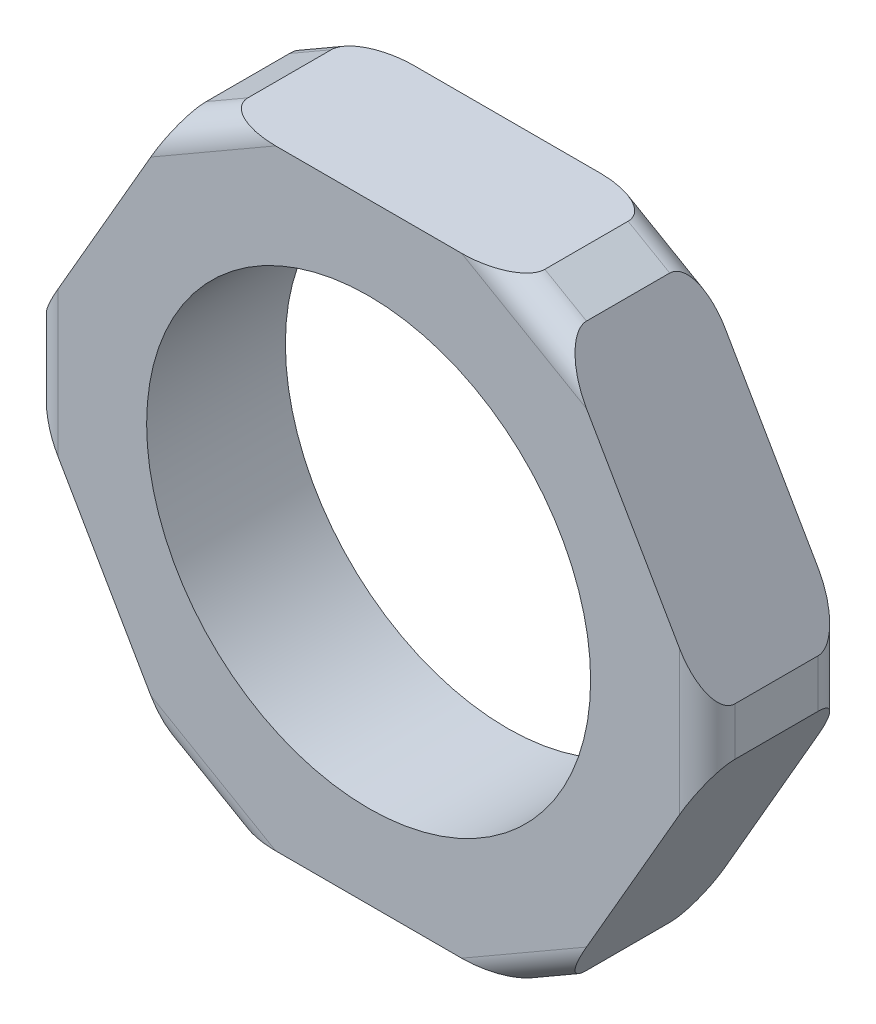
ISO-10303-21;
HEADER;
FILE_DESCRIPTION(('STEP AP214'),'2;1');
FILE_NAME('part.step','',(''),(''),'','','');
FILE_SCHEMA(('AUTOMOTIVE_DESIGN { 1 0 10303 214 1 1 1 1 }'));
ENDSEC;
DATA;
#1=APPLICATION_CONTEXT('core data for automotive mechanical design processes');
#2=APPLICATION_PROTOCOL_DEFINITION('international standard','automotive_design',2000,#1);
#3=PRODUCT_CONTEXT('',#1,'mechanical');
#4=PRODUCT('Part','Part','',(#3));
#5=PRODUCT_RELATED_PRODUCT_CATEGORY('part','',(#4));
#6=PRODUCT_DEFINITION_FORMATION('','',#4);
#7=PRODUCT_DEFINITION_CONTEXT('part definition',#1,'design');
#8=PRODUCT_DEFINITION('design','',#6,#7);
#9=PRODUCT_DEFINITION_SHAPE('','',#8);
#10=(LENGTH_UNIT() NAMED_UNIT(*) SI_UNIT(.MILLI.,.METRE.));
#11=(NAMED_UNIT(*) PLANE_ANGLE_UNIT() SI_UNIT($,.RADIAN.));
#12=(NAMED_UNIT(*) SI_UNIT($,.STERADIAN.) SOLID_ANGLE_UNIT());
#13=UNCERTAINTY_MEASURE_WITH_UNIT(LENGTH_MEASURE(1.E-05),#10,'distance_accuracy_value','');
#14=(GEOMETRIC_REPRESENTATION_CONTEXT(3) GLOBAL_UNCERTAINTY_ASSIGNED_CONTEXT((#13)) GLOBAL_UNIT_ASSIGNED_CONTEXT((#10,
#11,#12)) REPRESENTATION_CONTEXT('',''));
#15=CARTESIAN_POINT('',(0.,0.,0.));
#16=DIRECTION('',(0.,0.,1.));
#17=DIRECTION('',(1.,0.,0.));
#18=AXIS2_PLACEMENT_3D('',#15,#16,#17);
#19=CARTESIAN_POINT('',(0.,0.,2.5));
#20=DIRECTION('',(0.,0.,1.));
#21=DIRECTION('',(1.,0.,0.));
#22=AXIS2_PLACEMENT_3D('',#19,#20,#21);
#23=PLANE('',#22);
#24=DIRECTION('',(-0.5,0.866025403784438,0.));
#25=VECTOR('',#24,1.);
#26=CARTESIAN_POINT('',(12.7017059221718,0.,2.5));
#27=LINE('',#26,#25);
#28=CARTESIAN_POINT('',(11.2017059221718,2.59807621135329,2.5));
#29=VERTEX_POINT('',#28);
#30=CARTESIAN_POINT('',(7.85085296108589,8.40192378864667,2.5));
#31=VERTEX_POINT('',#30);
#32=EDGE_CURVE('E227',#29,#31,#27,.T.);
#33=ORIENTED_EDGE('',*,*,#32,.T.);
#34=DIRECTION('',(0.866025403784437,-0.500000000000002,0.));
#35=VECTOR('',#34,1.);
#36=CARTESIAN_POINT('',(5.60085296108591,9.70096189432332,2.5));
#37=LINE('',#36,#35);
#38=CARTESIAN_POINT('',(3.35085296108589,11.,2.5));
#39=VERTEX_POINT('',#38);
#40=EDGE_CURVE('E208',#31,#39,#37,.F.);
#41=ORIENTED_EDGE('',*,*,#40,.T.);
#42=DIRECTION('',(-1.,0.,0.));
#43=VECTOR('',#42,1.);
#44=CARTESIAN_POINT('',(6.35085296108588,11.,2.5));
#45=LINE('',#44,#43);
#46=CARTESIAN_POINT('',(-3.35085296108587,11.,2.5));
#47=VERTEX_POINT('',#46);
#48=EDGE_CURVE('E223',#39,#47,#45,.T.);
#49=ORIENTED_EDGE('',*,*,#48,.T.);
#50=DIRECTION('',(0.86602540378444,0.499999999999998,0.));
#51=VECTOR('',#50,1.);
#52=CARTESIAN_POINT('',(-5.60085296108586,9.70096189432336,2.5));
#53=LINE('',#52,#51);
#54=CARTESIAN_POINT('',(-7.85085296108588,8.40192378864669,2.5));
#55=VERTEX_POINT('',#54);
#56=EDGE_CURVE('E323',#47,#55,#53,.F.);
#57=ORIENTED_EDGE('',*,*,#56,.T.);
#58=DIRECTION('',(-0.5,-0.866025403784438,0.));
#59=VECTOR('',#58,1.);
#60=CARTESIAN_POINT('',(-6.35085296108589,11.,2.5));
#61=LINE('',#60,#59);
#62=CARTESIAN_POINT('',(-11.2017059221718,2.59807621135332,2.5));
#63=VERTEX_POINT('',#62);
#64=EDGE_CURVE('E236',#55,#63,#61,.T.);
#65=ORIENTED_EDGE('',*,*,#64,.T.);
#66=DIRECTION('',(0.,1.,0.));
#67=VECTOR('',#66,1.);
#68=CARTESIAN_POINT('',(-11.2017059221718,0.,2.5));
#69=LINE('',#68,#67);
#70=CARTESIAN_POINT('',(-11.2017059221718,-2.59807621135329,2.5));
#71=VERTEX_POINT('',#70);
#72=EDGE_CURVE('E326',#63,#71,#69,.F.);
#73=ORIENTED_EDGE('',*,*,#72,.T.);
#74=DIRECTION('',(0.5,-0.866025403784438,0.));
#75=VECTOR('',#74,1.);
#76=CARTESIAN_POINT('',(-12.7017059221718,0.,2.5));
#77=LINE('',#76,#75);
#78=CARTESIAN_POINT('',(-7.85085296108589,-8.40192378864667,2.5));
#79=VERTEX_POINT('',#78);
#80=EDGE_CURVE('E241',#71,#79,#77,.T.);
#81=ORIENTED_EDGE('',*,*,#80,.T.);
#82=DIRECTION('',(-0.866025403784438,0.500000000000002,0.));
#83=VECTOR('',#82,1.);
#84=CARTESIAN_POINT('',(-5.6008529610859,-9.70096189432332,2.5));
#85=LINE('',#84,#83);
#86=CARTESIAN_POINT('',(-3.35085296108589,-11.,2.5));
#87=VERTEX_POINT('',#86);
#88=EDGE_CURVE('E330',#79,#87,#85,.F.);
#89=ORIENTED_EDGE('',*,*,#88,.T.);
#90=DIRECTION('',(1.,0.,0.));
#91=VECTOR('',#90,1.);
#92=CARTESIAN_POINT('',(-6.35085296108588,-11.,2.5));
#93=LINE('',#92,#91);
#94=CARTESIAN_POINT('',(3.35085296108587,-11.,2.5));
#95=VERTEX_POINT('',#94);
#96=EDGE_CURVE('E250',#87,#95,#93,.T.);
#97=ORIENTED_EDGE('',*,*,#96,.T.);
#98=DIRECTION('',(-0.86602540378444,-0.499999999999999,0.));
#99=VECTOR('',#98,1.);
#100=CARTESIAN_POINT('',(5.60085296108587,-9.70096189432335,2.5));
#101=LINE('',#100,#99);
#102=CARTESIAN_POINT('',(7.85085296108588,-8.40192378864669,2.5));
#103=VERTEX_POINT('',#102);
#104=EDGE_CURVE('E334',#95,#103,#101,.F.);
#105=ORIENTED_EDGE('',*,*,#104,.T.);
#106=DIRECTION('',(0.5,0.866025403784439,0.));
#107=VECTOR('',#106,1.);
#108=CARTESIAN_POINT('',(6.35085296108589,-11.,2.5));
#109=LINE('',#108,#107);
#110=CARTESIAN_POINT('',(11.2017059221718,-2.59807621135333,2.5));
#111=VERTEX_POINT('',#110);
#112=EDGE_CURVE('E243',#103,#111,#109,.T.);
#113=ORIENTED_EDGE('',*,*,#112,.T.);
#114=DIRECTION('',(0.,-1.,0.));
#115=VECTOR('',#114,1.);
#116=CARTESIAN_POINT('',(11.2017059221718,0.,2.5));
#117=LINE('',#116,#115);
#118=EDGE_CURVE('E230',#111,#29,#117,.F.);
#119=ORIENTED_EDGE('',*,*,#118,.T.);
#120=EDGE_LOOP('',(#33,#41,#49,#57,#65,#73,#81,#89,#97,#105,#113,#119));
#121=FACE_BOUND('',#120,.T.);
#122=CARTESIAN_POINT('',(0.,0.,2.5));
#123=DIRECTION('',(0.,0.,1.));
#124=DIRECTION('',(1.,0.,0.));
#125=AXIS2_PLACEMENT_3D('',#122,#123,#124);
#126=CIRCLE('',#125,8.);
#127=CARTESIAN_POINT('',(8.,0.,2.5));
#128=VERTEX_POINT('',#127);
#129=EDGE_CURVE('E260',#128,#128,#126,.T.);
#130=ORIENTED_EDGE('',*,*,#129,.F.);
#131=EDGE_LOOP('',(#130));
#132=FACE_BOUND('',#131,.T.);
#133=ADVANCED_FACE('F39',(#121,#132),#23,.T.);
#134=CARTESIAN_POINT('',(0.,0.,-2.5));
#135=DIRECTION('',(0.,0.,1.));
#136=DIRECTION('',(1.,0.,0.));
#137=AXIS2_PLACEMENT_3D('',#134,#135,#136);
#138=PLANE('',#137);
#139=DIRECTION('',(-0.5,-0.866025403784438,0.));
#140=VECTOR('',#139,1.);
#141=CARTESIAN_POINT('',(-6.35085296108589,11.,-2.5));
#142=LINE('',#141,#140);
#143=CARTESIAN_POINT('',(-7.85085296108588,8.40192378864669,-2.5));
#144=VERTEX_POINT('',#143);
#145=CARTESIAN_POINT('',(-11.2017059221718,2.59807621135332,-2.5));
#146=VERTEX_POINT('',#145);
#147=EDGE_CURVE('E268',#144,#146,#142,.T.);
#148=ORIENTED_EDGE('',*,*,#147,.F.);
#149=DIRECTION('',(-0.86602540378444,-0.499999999999998,0.));
#150=VECTOR('',#149,1.);
#151=CARTESIAN_POINT('',(-4.85085296108588,10.1339745962156,-2.5));
#152=LINE('',#151,#150);
#153=CARTESIAN_POINT('',(-3.35085296108587,11.,-2.5));
#154=VERTEX_POINT('',#153);
#155=EDGE_CURVE('E11',#144,#154,#152,.F.);
#156=ORIENTED_EDGE('',*,*,#155,.T.);
#157=DIRECTION('',(-1.,0.,0.));
#158=VECTOR('',#157,1.);
#159=CARTESIAN_POINT('',(6.35085296108588,11.,-2.5));
#160=LINE('',#159,#158);
#161=CARTESIAN_POINT('',(3.35085296108589,11.,-2.5));
#162=VERTEX_POINT('',#161);
#163=EDGE_CURVE('E264',#162,#154,#160,.T.);
#164=ORIENTED_EDGE('',*,*,#163,.F.);
#165=DIRECTION('',(-0.866025403784437,0.500000000000002,0.));
#166=VECTOR('',#165,1.);
#167=CARTESIAN_POINT('',(6.35085296108588,9.26794919243112,-2.5));
#168=LINE('',#167,#166);
#169=CARTESIAN_POINT('',(7.85085296108589,8.40192378864667,-2.5));
#170=VERTEX_POINT('',#169);
#171=EDGE_CURVE('E48',#162,#170,#168,.F.);
#172=ORIENTED_EDGE('',*,*,#171,.T.);
#173=DIRECTION('',(-0.5,0.866025403784438,0.));
#174=VECTOR('',#173,1.);
#175=CARTESIAN_POINT('',(12.7017059221718,0.,-2.5));
#176=LINE('',#175,#174);
#177=CARTESIAN_POINT('',(11.2017059221718,2.59807621135329,-2.5));
#178=VERTEX_POINT('',#177);
#179=EDGE_CURVE('E259',#178,#170,#176,.T.);
#180=ORIENTED_EDGE('',*,*,#179,.F.);
#181=DIRECTION('',(0.,1.,0.));
#182=VECTOR('',#181,1.);
#183=CARTESIAN_POINT('',(11.2017059221718,-0.86602540378444,-2.5));
#184=LINE('',#183,#182);
#185=CARTESIAN_POINT('',(11.2017059221718,-2.59807621135333,-2.5));
#186=VERTEX_POINT('',#185);
#187=EDGE_CURVE('E450',#178,#186,#184,.F.);
#188=ORIENTED_EDGE('',*,*,#187,.T.);
#189=DIRECTION('',(0.5,0.866025403784439,0.));
#190=VECTOR('',#189,1.);
#191=CARTESIAN_POINT('',(6.35085296108589,-11.,-2.5));
#192=LINE('',#191,#190);
#193=CARTESIAN_POINT('',(7.85085296108588,-8.40192378864669,-2.5));
#194=VERTEX_POINT('',#193);
#195=EDGE_CURVE('E255',#194,#186,#192,.T.);
#196=ORIENTED_EDGE('',*,*,#195,.F.);
#197=DIRECTION('',(0.86602540378444,0.499999999999999,0.));
#198=VECTOR('',#197,1.);
#199=CARTESIAN_POINT('',(4.85085296108588,-10.1339745962156,-2.5));
#200=LINE('',#199,#198);
#201=CARTESIAN_POINT('',(3.35085296108587,-11.,-2.5));
#202=VERTEX_POINT('',#201);
#203=EDGE_CURVE('E446',#194,#202,#200,.F.);
#204=ORIENTED_EDGE('',*,*,#203,.T.);
#205=DIRECTION('',(1.,0.,0.));
#206=VECTOR('',#205,1.);
#207=CARTESIAN_POINT('',(-6.35085296108588,-11.,-2.5));
#208=LINE('',#207,#206);
#209=CARTESIAN_POINT('',(-3.35085296108589,-11.,-2.5));
#210=VERTEX_POINT('',#209);
#211=EDGE_CURVE('E275',#210,#202,#208,.T.);
#212=ORIENTED_EDGE('',*,*,#211,.F.);
#213=DIRECTION('',(0.866025403784438,-0.500000000000002,0.));
#214=VECTOR('',#213,1.);
#215=CARTESIAN_POINT('',(-6.35085296108589,-9.26794919243111,-2.5));
#216=LINE('',#215,#214);
#217=CARTESIAN_POINT('',(-7.85085296108589,-8.40192378864667,-2.5));
#218=VERTEX_POINT('',#217);
#219=EDGE_CURVE('E442',#210,#218,#216,.F.);
#220=ORIENTED_EDGE('',*,*,#219,.T.);
#221=DIRECTION('',(0.5,-0.866025403784438,0.));
#222=VECTOR('',#221,1.);
#223=CARTESIAN_POINT('',(-12.7017059221718,0.,-2.5));
#224=LINE('',#223,#222);
#225=CARTESIAN_POINT('',(-11.2017059221718,-2.59807621135329,-2.5));
#226=VERTEX_POINT('',#225);
#227=EDGE_CURVE('E271',#226,#218,#224,.T.);
#228=ORIENTED_EDGE('',*,*,#227,.F.);
#229=DIRECTION('',(0.,-1.,0.));
#230=VECTOR('',#229,1.);
#231=CARTESIAN_POINT('',(-11.2017059221718,0.866025403784441,-2.5));
#232=LINE('',#231,#230);
#233=EDGE_CURVE('E439',#226,#146,#232,.F.);
#234=ORIENTED_EDGE('',*,*,#233,.T.);
#235=EDGE_LOOP('',(#148,#156,#164,#172,#180,#188,#196,#204,#212,#220,#228,#234));
#236=FACE_BOUND('',#235,.T.);
#237=CARTESIAN_POINT('',(0.,0.,-2.5));
#238=DIRECTION('',(0.,0.,1.));
#239=DIRECTION('',(1.,0.,0.));
#240=AXIS2_PLACEMENT_3D('',#237,#238,#239);
#241=CIRCLE('',#240,8.);
#242=CARTESIAN_POINT('',(8.,0.,-2.5));
#243=VERTEX_POINT('',#242);
#244=EDGE_CURVE('E536',#243,#243,#241,.T.);
#245=ORIENTED_EDGE('',*,*,#244,.T.);
#246=EDGE_LOOP('',(#245));
#247=FACE_BOUND('',#246,.T.);
#248=ADVANCED_FACE('F459',(#236,#247),#138,.F.);
#249=CARTESIAN_POINT('',(6.35085296108589,-11.,2.5));
#250=DIRECTION('',(-0.866025403784439,0.5,0.));
#251=DIRECTION('',(-0.5,-0.866025403784439,0.));
#252=AXIS2_PLACEMENT_3D('',#249,#250,#251);
#253=PLANE('',#252);
#254=DIRECTION('',(0.,0.,1.));
#255=VECTOR('',#254,1.);
#256=CARTESIAN_POINT('',(12.2017059221718,-0.866025403784445,2.5));
#257=LINE('',#256,#255);
#258=CARTESIAN_POINT('',(12.2017059221718,-0.866025403784445,-1.5));
#259=VERTEX_POINT('',#258);
#260=CARTESIAN_POINT('',(12.2017059221718,-0.866025403784445,1.5));
#261=VERTEX_POINT('',#260);
#262=EDGE_CURVE('E307',#259,#261,#257,.T.);
#263=ORIENTED_EDGE('',*,*,#262,.T.);
#264=CARTESIAN_POINT('',(11.2017059221718,-2.59807621135334,1.5));
#265=DIRECTION('',(-0.866025403784439,0.5,0.));
#266=DIRECTION('',(-0.5,-0.866025403784439,0.));
#267=AXIS2_PLACEMENT_3D('',#264,#265,#266);
#268=ELLIPSE('',#267,2.00000000000001,1.);
#269=EDGE_CURVE('E378',#261,#111,#268,.F.);
#270=ORIENTED_EDGE('',*,*,#269,.T.);
#271=ORIENTED_EDGE('',*,*,#112,.F.);
#272=CARTESIAN_POINT('',(7.85085296108588,-8.40192378864669,1.5));
#273=DIRECTION('',(-0.866025403784439,0.5,0.));
#274=DIRECTION('',(-0.5,-0.866025403784439,0.));
#275=AXIS2_PLACEMENT_3D('',#272,#273,#274);
#276=ELLIPSE('',#275,1.99999999999999,1.);
#277=CARTESIAN_POINT('',(6.85085296108589,-10.1339745962156,1.5));
#278=VERTEX_POINT('',#277);
#279=EDGE_CURVE('E375',#103,#278,#276,.F.);
#280=ORIENTED_EDGE('',*,*,#279,.T.);
#281=DIRECTION('',(0.,0.,-1.));
#282=VECTOR('',#281,1.);
#283=CARTESIAN_POINT('',(6.85085296108589,-10.1339745962156,2.5));
#284=LINE('',#283,#282);
#285=CARTESIAN_POINT('',(6.85085296108589,-10.1339745962156,-1.5));
#286=VERTEX_POINT('',#285);
#287=EDGE_CURVE('E311',#278,#286,#284,.T.);
#288=ORIENTED_EDGE('',*,*,#287,.T.);
#289=CARTESIAN_POINT('',(7.85085296108588,-8.40192378864669,-1.5));
#290=DIRECTION('',(-0.866025403784439,0.5,0.));
#291=DIRECTION('',(-0.5,-0.866025403784439,0.));
#292=AXIS2_PLACEMENT_3D('',#289,#290,#291);
#293=ELLIPSE('',#292,1.99999999999999,1.);
#294=EDGE_CURVE('E369',#286,#194,#293,.F.);
#295=ORIENTED_EDGE('',*,*,#294,.T.);
#296=ORIENTED_EDGE('',*,*,#195,.T.);
#297=CARTESIAN_POINT('',(11.2017059221718,-2.59807621135334,-1.5));
#298=DIRECTION('',(-0.866025403784439,0.5,0.));
#299=DIRECTION('',(-0.5,-0.866025403784439,0.));
#300=AXIS2_PLACEMENT_3D('',#297,#298,#299);
#301=ELLIPSE('',#300,2.00000000000001,1.);
#302=EDGE_CURVE('E372',#186,#259,#301,.F.);
#303=ORIENTED_EDGE('',*,*,#302,.T.);
#304=EDGE_LOOP('',(#263,#270,#271,#280,#288,#295,#296,#303));
#305=FACE_BOUND('',#304,.T.);
#306=ADVANCED_FACE('F475',(#305),#253,.F.);
#307=CARTESIAN_POINT('',(12.7017059221718,0.,2.5));
#308=DIRECTION('',(-0.866025403784438,-0.5,0.));
#309=DIRECTION('',(0.5,-0.866025403784438,0.));
#310=AXIS2_PLACEMENT_3D('',#307,#308,#309);
#311=PLANE('',#310);
#312=DIRECTION('',(0.,0.,1.));
#313=VECTOR('',#312,1.);
#314=CARTESIAN_POINT('',(6.85085296108588,10.1339745962156,2.5));
#315=LINE('',#314,#313);
#316=CARTESIAN_POINT('',(6.85085296108588,10.1339745962156,-1.5));
#317=VERTEX_POINT('',#316);
#318=CARTESIAN_POINT('',(6.85085296108588,10.1339745962156,1.5));
#319=VERTEX_POINT('',#318);
#320=EDGE_CURVE('E315',#317,#319,#315,.T.);
#321=ORIENTED_EDGE('',*,*,#320,.T.);
#322=CARTESIAN_POINT('',(7.85085296108589,8.40192378864667,1.5));
#323=DIRECTION('',(-0.866025403784438,-0.5,0.));
#324=DIRECTION('',(0.5,-0.866025403784438,0.));
#325=AXIS2_PLACEMENT_3D('',#322,#323,#324);
#326=ELLIPSE('',#325,2.00000000000001,1.);
#327=EDGE_CURVE('E360',#319,#31,#326,.F.);
#328=ORIENTED_EDGE('',*,*,#327,.T.);
#329=ORIENTED_EDGE('',*,*,#32,.F.);
#330=CARTESIAN_POINT('',(11.2017059221718,2.59807621135329,1.5));
#331=DIRECTION('',(-0.866025403784438,-0.5,0.));
#332=DIRECTION('',(0.5,-0.866025403784438,0.));
#333=AXIS2_PLACEMENT_3D('',#330,#331,#332);
#334=ELLIPSE('',#333,1.99999999999998,1.);
#335=CARTESIAN_POINT('',(12.2017059221718,0.866025403784428,1.5));
#336=VERTEX_POINT('',#335);
#337=EDGE_CURVE('E357',#29,#336,#334,.F.);
#338=ORIENTED_EDGE('',*,*,#337,.T.);
#339=DIRECTION('',(0.,0.,-1.));
#340=VECTOR('',#339,1.);
#341=CARTESIAN_POINT('',(12.2017059221718,0.866025403784428,2.5));
#342=LINE('',#341,#340);
#343=CARTESIAN_POINT('',(12.2017059221718,0.866025403784428,-1.5));
#344=VERTEX_POINT('',#343);
#345=EDGE_CURVE('E319',#336,#344,#342,.T.);
#346=ORIENTED_EDGE('',*,*,#345,.T.);
#347=CARTESIAN_POINT('',(11.2017059221718,2.59807621135329,-1.5));
#348=DIRECTION('',(-0.866025403784438,-0.5,0.));
#349=DIRECTION('',(0.5,-0.866025403784438,0.));
#350=AXIS2_PLACEMENT_3D('',#347,#348,#349);
#351=ELLIPSE('',#350,1.99999999999998,1.);
#352=EDGE_CURVE('E351',#344,#178,#351,.F.);
#353=ORIENTED_EDGE('',*,*,#352,.T.);
#354=ORIENTED_EDGE('',*,*,#179,.T.);
#355=CARTESIAN_POINT('',(7.85085296108589,8.40192378864667,-1.5));
#356=DIRECTION('',(-0.866025403784438,-0.5,0.));
#357=DIRECTION('',(0.5,-0.866025403784438,0.));
#358=AXIS2_PLACEMENT_3D('',#355,#356,#357);
#359=ELLIPSE('',#358,2.00000000000001,1.);
#360=EDGE_CURVE('E354',#170,#317,#359,.F.);
#361=ORIENTED_EDGE('',*,*,#360,.T.);
#362=EDGE_LOOP('',(#321,#328,#329,#338,#346,#353,#354,#361));
#363=FACE_BOUND('',#362,.T.);
#364=ADVANCED_FACE('F465',(#363),#311,.F.);
#365=CARTESIAN_POINT('',(6.35085296108588,11.,2.5));
#366=DIRECTION('',(0.,-1.,0.));
#367=DIRECTION('',(0.,0.,-1.));
#368=AXIS2_PLACEMENT_3D('',#365,#366,#367);
#369=PLANE('',#368);
#370=ORIENTED_EDGE('',*,*,#48,.F.);
#371=CARTESIAN_POINT('',(3.35085296108589,11.,1.5));
#372=DIRECTION('',(0.,-1.,0.));
#373=DIRECTION('',(1.,0.,0.));
#374=AXIS2_PLACEMENT_3D('',#371,#372,#373);
#375=ELLIPSE('',#374,1.99999999999999,1.);
#376=CARTESIAN_POINT('',(5.35085296108588,11.,1.5));
#377=VERTEX_POINT('',#376);
#378=EDGE_CURVE('E204',#39,#377,#375,.F.);
#379=ORIENTED_EDGE('',*,*,#378,.T.);
#380=DIRECTION('',(0.,0.,-1.));
#381=VECTOR('',#380,1.);
#382=CARTESIAN_POINT('',(5.35085296108588,11.,2.5));
#383=LINE('',#382,#381);
#384=CARTESIAN_POINT('',(5.35085296108588,11.,-1.5));
#385=VERTEX_POINT('',#384);
#386=EDGE_CURVE('E285',#377,#385,#383,.T.);
#387=ORIENTED_EDGE('',*,*,#386,.T.);
#388=CARTESIAN_POINT('',(3.35085296108589,11.,-1.5));
#389=DIRECTION('',(0.,-1.,0.));
#390=DIRECTION('',(1.,0.,0.));
#391=AXIS2_PLACEMENT_3D('',#388,#389,#390);
#392=ELLIPSE('',#391,1.99999999999999,1.);
#393=EDGE_CURVE('E229',#385,#162,#392,.F.);
#394=ORIENTED_EDGE('',*,*,#393,.T.);
#395=ORIENTED_EDGE('',*,*,#163,.T.);
#396=CARTESIAN_POINT('',(-3.35085296108587,11.,-1.5));
#397=DIRECTION('',(0.,-1.,0.));
#398=DIRECTION('',(1.,0.,0.));
#399=AXIS2_PLACEMENT_3D('',#396,#397,#398);
#400=ELLIPSE('',#399,2.00000000000001,1.);
#401=CARTESIAN_POINT('',(-5.35085296108588,11.,-1.5));
#402=VERTEX_POINT('',#401);
#403=EDGE_CURVE('E342',#154,#402,#400,.F.);
#404=ORIENTED_EDGE('',*,*,#403,.T.);
#405=DIRECTION('',(0.,0.,1.));
#406=VECTOR('',#405,1.);
#407=CARTESIAN_POINT('',(-5.35085296108588,11.,2.5));
#408=LINE('',#407,#406);
#409=CARTESIAN_POINT('',(-5.35085296108588,11.,1.5));
#410=VERTEX_POINT('',#409);
#411=EDGE_CURVE('E288',#402,#410,#408,.T.);
#412=ORIENTED_EDGE('',*,*,#411,.T.);
#413=CARTESIAN_POINT('',(-3.35085296108587,11.,1.5));
#414=DIRECTION('',(0.,-1.,0.));
#415=DIRECTION('',(1.,0.,0.));
#416=AXIS2_PLACEMENT_3D('',#413,#414,#415);
#417=ELLIPSE('',#416,2.00000000000001,1.);
#418=EDGE_CURVE('E216',#410,#47,#417,.F.);
#419=ORIENTED_EDGE('',*,*,#418,.T.);
#420=EDGE_LOOP('',(#370,#379,#387,#394,#395,#404,#412,#419));
#421=FACE_BOUND('',#420,.T.);
#422=ADVANCED_FACE('F232',(#421),#369,.F.);
#423=CARTESIAN_POINT('',(-6.35085296108589,11.,2.5));
#424=DIRECTION('',(0.866025403784439,-0.5,0.));
#425=DIRECTION('',(0.5,0.866025403784439,0.));
#426=AXIS2_PLACEMENT_3D('',#423,#424,#425);
#427=PLANE('',#426);
#428=DIRECTION('',(0.,0.,1.));
#429=VECTOR('',#428,1.);
#430=CARTESIAN_POINT('',(-12.2017059221718,0.866025403784443,2.5));
#431=LINE('',#430,#429);
#432=CARTESIAN_POINT('',(-12.2017059221718,0.866025403784443,-1.5));
#433=VERTEX_POINT('',#432);
#434=CARTESIAN_POINT('',(-12.2017059221718,0.866025403784443,1.5));
#435=VERTEX_POINT('',#434);
#436=EDGE_CURVE('E254',#433,#435,#431,.T.);
#437=ORIENTED_EDGE('',*,*,#436,.T.);
#438=CARTESIAN_POINT('',(-11.2017059221718,2.59807621135332,1.5));
#439=DIRECTION('',(0.866025403784439,-0.5,0.));
#440=DIRECTION('',(0.5,0.866025403784439,0.));
#441=AXIS2_PLACEMENT_3D('',#438,#439,#440);
#442=ELLIPSE('',#441,2.00000000000001,1.);
#443=EDGE_CURVE('E430',#435,#63,#442,.F.);
#444=ORIENTED_EDGE('',*,*,#443,.T.);
#445=ORIENTED_EDGE('',*,*,#64,.F.);
#446=CARTESIAN_POINT('',(-7.85085296108588,8.40192378864669,1.5));
#447=DIRECTION('',(0.866025403784439,-0.5,0.));
#448=DIRECTION('',(0.5,0.866025403784439,0.));
#449=AXIS2_PLACEMENT_3D('',#446,#447,#448);
#450=ELLIPSE('',#449,1.99999999999999,1.);
#451=CARTESIAN_POINT('',(-6.85085296108589,10.1339745962156,1.5));
#452=VERTEX_POINT('',#451);
#453=EDGE_CURVE('E427',#55,#452,#450,.F.);
#454=ORIENTED_EDGE('',*,*,#453,.T.);
#455=DIRECTION('',(0.,0.,-1.));
#456=VECTOR('',#455,1.);
#457=CARTESIAN_POINT('',(-6.85085296108589,10.1339745962156,2.5));
#458=LINE('',#457,#456);
#459=CARTESIAN_POINT('',(-6.85085296108589,10.1339745962156,-1.5));
#460=VERTEX_POINT('',#459);
#461=EDGE_CURVE('E282',#452,#460,#458,.T.);
#462=ORIENTED_EDGE('',*,*,#461,.T.);
#463=CARTESIAN_POINT('',(-7.85085296108588,8.40192378864669,-1.5));
#464=DIRECTION('',(0.866025403784439,-0.5,0.));
#465=DIRECTION('',(0.5,0.866025403784439,0.));
#466=AXIS2_PLACEMENT_3D('',#463,#464,#465);
#467=ELLIPSE('',#466,1.99999999999999,1.);
#468=EDGE_CURVE('E63',#460,#144,#467,.F.);
#469=ORIENTED_EDGE('',*,*,#468,.T.);
#470=ORIENTED_EDGE('',*,*,#147,.T.);
#471=CARTESIAN_POINT('',(-11.2017059221718,2.59807621135332,-1.5));
#472=DIRECTION('',(0.866025403784439,-0.5,0.));
#473=DIRECTION('',(0.5,0.866025403784439,0.));
#474=AXIS2_PLACEMENT_3D('',#471,#472,#473);
#475=ELLIPSE('',#474,2.00000000000001,1.);
#476=EDGE_CURVE('E55',#146,#433,#475,.F.);
#477=ORIENTED_EDGE('',*,*,#476,.T.);
#478=EDGE_LOOP('',(#437,#444,#445,#454,#462,#469,#470,#477));
#479=FACE_BOUND('',#478,.T.);
#480=ADVANCED_FACE('F499',(#479),#427,.F.);
#481=CARTESIAN_POINT('',(-12.7017059221718,0.,2.5));
#482=DIRECTION('',(0.866025403784438,0.5,0.));
#483=DIRECTION('',(-0.5,0.866025403784438,0.));
#484=AXIS2_PLACEMENT_3D('',#481,#482,#483);
#485=PLANE('',#484);
#486=DIRECTION('',(0.,0.,1.));
#487=VECTOR('',#486,1.);
#488=CARTESIAN_POINT('',(-6.85085296108588,-10.1339745962156,2.5));
#489=LINE('',#488,#487);
#490=CARTESIAN_POINT('',(-6.85085296108588,-10.1339745962156,-1.5));
#491=VERTEX_POINT('',#490);
#492=CARTESIAN_POINT('',(-6.85085296108588,-10.1339745962156,1.5));
#493=VERTEX_POINT('',#492);
#494=EDGE_CURVE('E291',#491,#493,#489,.T.);
#495=ORIENTED_EDGE('',*,*,#494,.T.);
#496=CARTESIAN_POINT('',(-7.85085296108589,-8.40192378864667,1.5));
#497=DIRECTION('',(0.866025403784438,0.5,0.));
#498=DIRECTION('',(-0.5,0.866025403784438,0.));
#499=AXIS2_PLACEMENT_3D('',#496,#497,#498);
#500=ELLIPSE('',#499,2.00000000000001,1.);
#501=EDGE_CURVE('E414',#493,#79,#500,.F.);
#502=ORIENTED_EDGE('',*,*,#501,.T.);
#503=ORIENTED_EDGE('',*,*,#80,.F.);
#504=CARTESIAN_POINT('',(-11.2017059221718,-2.59807621135329,1.5));
#505=DIRECTION('',(0.866025403784438,0.5,0.));
#506=DIRECTION('',(-0.5,0.866025403784438,0.));
#507=AXIS2_PLACEMENT_3D('',#504,#505,#506);
#508=ELLIPSE('',#507,1.99999999999999,1.);
#509=CARTESIAN_POINT('',(-12.2017059221718,-0.866025403784428,1.5));
#510=VERTEX_POINT('',#509);
#511=EDGE_CURVE('E411',#71,#510,#508,.F.);
#512=ORIENTED_EDGE('',*,*,#511,.T.);
#513=DIRECTION('',(0.,0.,-1.));
#514=VECTOR('',#513,1.);
#515=CARTESIAN_POINT('',(-12.2017059221718,-0.866025403784428,2.5));
#516=LINE('',#515,#514);
#517=CARTESIAN_POINT('',(-12.2017059221718,-0.866025403784428,-1.5));
#518=VERTEX_POINT('',#517);
#519=EDGE_CURVE('E295',#510,#518,#516,.T.);
#520=ORIENTED_EDGE('',*,*,#519,.T.);
#521=CARTESIAN_POINT('',(-11.2017059221718,-2.59807621135329,-1.5));
#522=DIRECTION('',(0.866025403784438,0.5,0.));
#523=DIRECTION('',(-0.5,0.866025403784438,0.));
#524=AXIS2_PLACEMENT_3D('',#521,#522,#523);
#525=ELLIPSE('',#524,1.99999999999999,1.);
#526=EDGE_CURVE('E405',#518,#226,#525,.F.);
#527=ORIENTED_EDGE('',*,*,#526,.T.);
#528=ORIENTED_EDGE('',*,*,#227,.T.);
#529=CARTESIAN_POINT('',(-7.85085296108589,-8.40192378864667,-1.5));
#530=DIRECTION('',(0.866025403784438,0.5,0.));
#531=DIRECTION('',(-0.5,0.866025403784438,0.));
#532=AXIS2_PLACEMENT_3D('',#529,#530,#531);
#533=ELLIPSE('',#532,2.00000000000001,1.);
#534=EDGE_CURVE('E408',#218,#491,#533,.F.);
#535=ORIENTED_EDGE('',*,*,#534,.T.);
#536=EDGE_LOOP('',(#495,#502,#503,#512,#520,#527,#528,#535));
#537=FACE_BOUND('',#536,.T.);
#538=ADVANCED_FACE('F494',(#537),#485,.F.);
#539=CARTESIAN_POINT('',(-6.35085296108588,-11.,2.5));
#540=DIRECTION('',(0.,1.,0.));
#541=DIRECTION('',(0.,0.,1.));
#542=AXIS2_PLACEMENT_3D('',#539,#540,#541);
#543=PLANE('',#542);
#544=DIRECTION('',(0.,0.,1.));
#545=VECTOR('',#544,1.);
#546=CARTESIAN_POINT('',(5.35085296108588,-11.,2.5));
#547=LINE('',#546,#545);
#548=CARTESIAN_POINT('',(5.35085296108588,-11.,-1.5));
#549=VERTEX_POINT('',#548);
#550=CARTESIAN_POINT('',(5.35085296108588,-11.,1.5));
#551=VERTEX_POINT('',#550);
#552=EDGE_CURVE('E299',#549,#551,#547,.T.);
#553=ORIENTED_EDGE('',*,*,#552,.T.);
#554=CARTESIAN_POINT('',(3.35085296108588,-11.,1.5));
#555=DIRECTION('',(0.,1.,0.));
#556=DIRECTION('',(-1.,0.,0.));
#557=AXIS2_PLACEMENT_3D('',#554,#555,#556);
#558=ELLIPSE('',#557,2.00000000000001,1.);
#559=EDGE_CURVE('E396',#551,#95,#558,.F.);
#560=ORIENTED_EDGE('',*,*,#559,.T.);
#561=ORIENTED_EDGE('',*,*,#96,.F.);
#562=CARTESIAN_POINT('',(-3.35085296108589,-11.,1.5));
#563=DIRECTION('',(0.,1.,0.));
#564=DIRECTION('',(-1.,0.,0.));
#565=AXIS2_PLACEMENT_3D('',#562,#563,#564);
#566=ELLIPSE('',#565,1.99999999999999,1.);
#567=CARTESIAN_POINT('',(-5.35085296108588,-11.,1.5));
#568=VERTEX_POINT('',#567);
#569=EDGE_CURVE('E393',#87,#568,#566,.F.);
#570=ORIENTED_EDGE('',*,*,#569,.T.);
#571=DIRECTION('',(0.,0.,-1.));
#572=VECTOR('',#571,1.);
#573=CARTESIAN_POINT('',(-5.35085296108588,-11.,2.5));
#574=LINE('',#573,#572);
#575=CARTESIAN_POINT('',(-5.35085296108588,-11.,-1.5));
#576=VERTEX_POINT('',#575);
#577=EDGE_CURVE('E303',#568,#576,#574,.T.);
#578=ORIENTED_EDGE('',*,*,#577,.T.);
#579=CARTESIAN_POINT('',(-3.35085296108589,-11.,-1.5));
#580=DIRECTION('',(0.,1.,0.));
#581=DIRECTION('',(-1.,0.,0.));
#582=AXIS2_PLACEMENT_3D('',#579,#580,#581);
#583=ELLIPSE('',#582,1.99999999999999,1.);
#584=EDGE_CURVE('E387',#576,#210,#583,.F.);
#585=ORIENTED_EDGE('',*,*,#584,.T.);
#586=ORIENTED_EDGE('',*,*,#211,.T.);
#587=CARTESIAN_POINT('',(3.35085296108588,-11.,-1.5));
#588=DIRECTION('',(0.,1.,0.));
#589=DIRECTION('',(-1.,0.,0.));
#590=AXIS2_PLACEMENT_3D('',#587,#588,#589);
#591=ELLIPSE('',#590,2.00000000000001,1.);
#592=EDGE_CURVE('E390',#202,#549,#591,.F.);
#593=ORIENTED_EDGE('',*,*,#592,.T.);
#594=EDGE_LOOP('',(#553,#560,#561,#570,#578,#585,#586,#593));
#595=FACE_BOUND('',#594,.T.);
#596=ADVANCED_FACE('F485',(#595),#543,.F.);
#597=CARTESIAN_POINT('',(0.,0.,2.5));
#598=DIRECTION('',(0.,0.,-1.));
#599=DIRECTION('',(-1.,0.,0.));
#600=AXIS2_PLACEMENT_3D('',#597,#598,#599);
#601=CYLINDRICAL_SURFACE('',#600,8.);
#602=ORIENTED_EDGE('',*,*,#129,.T.);
#603=EDGE_LOOP('',(#602));
#604=FACE_BOUND('',#603,.T.);
#605=ORIENTED_EDGE('',*,*,#244,.F.);
#606=EDGE_LOOP('',(#605));
#607=FACE_BOUND('',#606,.T.);
#608=ADVANCED_FACE('F544',(#604,#607),#601,.F.);
#609=CARTESIAN_POINT('',(-6.85085296108589,10.1339745962156,2.5));
#610=DIRECTION('',(0.499999999999998,-0.86602540378444,0.));
#611=DIRECTION('',(0.,0.,-1.));
#612=AXIS2_PLACEMENT_3D('',#609,#610,#611);
#613=PLANE('',#612);
#614=ORIENTED_EDGE('',*,*,#461,.F.);
#615=DIRECTION('',(-0.86602540378444,-0.499999999999998,0.));
#616=VECTOR('',#615,1.);
#617=CARTESIAN_POINT('',(-6.85085296108589,10.1339745962156,1.5));
#618=LINE('',#617,#616);
#619=EDGE_CURVE('E436',#452,#410,#618,.F.);
#620=ORIENTED_EDGE('',*,*,#619,.T.);
#621=ORIENTED_EDGE('',*,*,#411,.F.);
#622=DIRECTION('',(0.86602540378444,0.499999999999998,0.));
#623=VECTOR('',#622,1.);
#624=CARTESIAN_POINT('',(-6.85085296108589,10.1339745962156,-1.5));
#625=LINE('',#624,#623);
#626=EDGE_CURVE('E433',#402,#460,#625,.F.);
#627=ORIENTED_EDGE('',*,*,#626,.T.);
#628=EDGE_LOOP('',(#614,#620,#621,#627));
#629=FACE_BOUND('',#628,.T.);
#630=ADVANCED_FACE('F515',(#629),#613,.F.);
#631=CARTESIAN_POINT('',(-12.2017059221718,-0.866025403784428,2.5));
#632=DIRECTION('',(1.,0.,0.));
#633=DIRECTION('',(0.,0.,-1.));
#634=AXIS2_PLACEMENT_3D('',#631,#632,#633);
#635=PLANE('',#634);
#636=ORIENTED_EDGE('',*,*,#519,.F.);
#637=DIRECTION('',(0.,-1.,0.));
#638=VECTOR('',#637,1.);
#639=CARTESIAN_POINT('',(-12.2017059221718,-0.866025403784428,1.5));
#640=LINE('',#639,#638);
#641=EDGE_CURVE('E420',#510,#435,#640,.F.);
#642=ORIENTED_EDGE('',*,*,#641,.T.);
#643=ORIENTED_EDGE('',*,*,#436,.F.);
#644=DIRECTION('',(0.,1.,0.));
#645=VECTOR('',#644,1.);
#646=CARTESIAN_POINT('',(-12.2017059221718,-0.866025403784428,-1.5));
#647=LINE('',#646,#645);
#648=EDGE_CURVE('E417',#433,#518,#647,.F.);
#649=ORIENTED_EDGE('',*,*,#648,.T.);
#650=EDGE_LOOP('',(#636,#642,#643,#649));
#651=FACE_BOUND('',#650,.T.);
#652=ADVANCED_FACE('F503',(#651),#635,.F.);
#653=CARTESIAN_POINT('',(-5.35085296108588,-11.,2.5));
#654=DIRECTION('',(0.500000000000002,0.866025403784437,0.));
#655=DIRECTION('',(0.,0.,-1.));
#656=AXIS2_PLACEMENT_3D('',#653,#654,#655);
#657=PLANE('',#656);
#658=ORIENTED_EDGE('',*,*,#577,.F.);
#659=DIRECTION('',(0.866025403784438,-0.500000000000002,0.));
#660=VECTOR('',#659,1.);
#661=CARTESIAN_POINT('',(-5.35085296108588,-11.,1.5));
#662=LINE('',#661,#660);
#663=EDGE_CURVE('E402',#568,#493,#662,.F.);
#664=ORIENTED_EDGE('',*,*,#663,.T.);
#665=ORIENTED_EDGE('',*,*,#494,.F.);
#666=DIRECTION('',(-0.866025403784438,0.500000000000002,0.));
#667=VECTOR('',#666,1.);
#668=CARTESIAN_POINT('',(-5.35085296108588,-11.,-1.5));
#669=LINE('',#668,#667);
#670=EDGE_CURVE('E399',#491,#576,#669,.F.);
#671=ORIENTED_EDGE('',*,*,#670,.T.);
#672=EDGE_LOOP('',(#658,#664,#665,#671));
#673=FACE_BOUND('',#672,.T.);
#674=ADVANCED_FACE('F570',(#673),#657,.F.);
#675=CARTESIAN_POINT('',(6.85085296108589,-10.1339745962156,2.5));
#676=DIRECTION('',(-0.499999999999998,0.866025403784439,0.));
#677=DIRECTION('',(0.,0.,-1.));
#678=AXIS2_PLACEMENT_3D('',#675,#676,#677);
#679=PLANE('',#678);
#680=ORIENTED_EDGE('',*,*,#287,.F.);
#681=DIRECTION('',(0.86602540378444,0.499999999999999,0.));
#682=VECTOR('',#681,1.);
#683=CARTESIAN_POINT('',(6.85085296108589,-10.1339745962156,1.5));
#684=LINE('',#683,#682);
#685=EDGE_CURVE('E384',#278,#551,#684,.F.);
#686=ORIENTED_EDGE('',*,*,#685,.T.);
#687=ORIENTED_EDGE('',*,*,#552,.F.);
#688=DIRECTION('',(-0.86602540378444,-0.499999999999999,0.));
#689=VECTOR('',#688,1.);
#690=CARTESIAN_POINT('',(6.85085296108589,-10.1339745962156,-1.5));
#691=LINE('',#690,#689);
#692=EDGE_CURVE('E381',#549,#286,#691,.F.);
#693=ORIENTED_EDGE('',*,*,#692,.T.);
#694=EDGE_LOOP('',(#680,#686,#687,#693));
#695=FACE_BOUND('',#694,.T.);
#696=ADVANCED_FACE('F573',(#695),#679,.F.);
#697=CARTESIAN_POINT('',(12.2017059221718,0.866025403784429,2.5));
#698=DIRECTION('',(-1.,0.,0.));
#699=DIRECTION('',(0.,0.,-1.));
#700=AXIS2_PLACEMENT_3D('',#697,#698,#699);
#701=PLANE('',#700);
#702=ORIENTED_EDGE('',*,*,#345,.F.);
#703=DIRECTION('',(0.,1.,0.));
#704=VECTOR('',#703,1.);
#705=CARTESIAN_POINT('',(12.2017059221718,0.866025403784429,1.5));
#706=LINE('',#705,#704);
#707=EDGE_CURVE('E366',#336,#261,#706,.F.);
#708=ORIENTED_EDGE('',*,*,#707,.T.);
#709=ORIENTED_EDGE('',*,*,#262,.F.);
#710=DIRECTION('',(0.,-1.,0.));
#711=VECTOR('',#710,1.);
#712=CARTESIAN_POINT('',(12.2017059221718,0.866025403784427,-1.5));
#713=LINE('',#712,#711);
#714=EDGE_CURVE('E363',#259,#344,#713,.F.);
#715=ORIENTED_EDGE('',*,*,#714,.T.);
#716=EDGE_LOOP('',(#702,#708,#709,#715));
#717=FACE_BOUND('',#716,.T.);
#718=ADVANCED_FACE('F528',(#717),#701,.F.);
#719=CARTESIAN_POINT('',(5.35085296108588,11.,2.5));
#720=DIRECTION('',(-0.500000000000002,-0.866025403784437,0.));
#721=DIRECTION('',(0.,0.,-1.));
#722=AXIS2_PLACEMENT_3D('',#719,#720,#721);
#723=PLANE('',#722);
#724=ORIENTED_EDGE('',*,*,#386,.F.);
#725=DIRECTION('',(-0.866025403784437,0.500000000000002,0.));
#726=VECTOR('',#725,1.);
#727=CARTESIAN_POINT('',(5.35085296108588,11.,1.5));
#728=LINE('',#727,#726);
#729=EDGE_CURVE('E209',#377,#319,#728,.F.);
#730=ORIENTED_EDGE('',*,*,#729,.T.);
#731=ORIENTED_EDGE('',*,*,#320,.F.);
#732=DIRECTION('',(0.866025403784437,-0.500000000000002,0.));
#733=VECTOR('',#732,1.);
#734=CARTESIAN_POINT('',(5.35085296108588,11.,-1.5));
#735=LINE('',#734,#733);
#736=EDGE_CURVE('E215',#317,#385,#735,.F.);
#737=ORIENTED_EDGE('',*,*,#736,.T.);
#738=EDGE_LOOP('',(#724,#730,#731,#737));
#739=FACE_BOUND('',#738,.T.);
#740=ADVANCED_FACE('F523',(#739),#723,.F.);
#741=CARTESIAN_POINT('',(5.60085296108591,9.70096189432332,1.5));
#742=DIRECTION('',(0.866025403784437,-0.500000000000002,0.));
#743=DIRECTION('',(0.500000000000002,0.866025403784437,0.));
#744=AXIS2_PLACEMENT_3D('',#741,#742,#743);
#745=CYLINDRICAL_SURFACE('',#744,1.);
#746=ORIENTED_EDGE('',*,*,#327,.F.);
#747=ORIENTED_EDGE('',*,*,#729,.F.);
#748=ORIENTED_EDGE('',*,*,#378,.F.);
#749=ORIENTED_EDGE('',*,*,#40,.F.);
#750=EDGE_LOOP('',(#746,#747,#748,#749));
#751=FACE_BOUND('',#750,.T.);
#752=ADVANCED_FACE('F207',(#751),#745,.T.);
#753=CARTESIAN_POINT('',(11.2017059221718,0.,1.5));
#754=DIRECTION('',(0.,-1.,0.));
#755=DIRECTION('',(1.,0.,0.));
#756=AXIS2_PLACEMENT_3D('',#753,#754,#755);
#757=CYLINDRICAL_SURFACE('',#756,1.);
#758=ORIENTED_EDGE('',*,*,#269,.F.);
#759=ORIENTED_EDGE('',*,*,#707,.F.);
#760=ORIENTED_EDGE('',*,*,#337,.F.);
#761=ORIENTED_EDGE('',*,*,#118,.F.);
#762=EDGE_LOOP('',(#758,#759,#760,#761));
#763=FACE_BOUND('',#762,.T.);
#764=ADVANCED_FACE('F530',(#763),#757,.T.);
#765=CARTESIAN_POINT('',(5.60085296108587,-9.70096189432335,1.5));
#766=DIRECTION('',(-0.86602540378444,-0.499999999999999,0.));
#767=DIRECTION('',(0.499999999999998,-0.866025403784439,0.));
#768=AXIS2_PLACEMENT_3D('',#765,#766,#767);
#769=CYLINDRICAL_SURFACE('',#768,1.);
#770=ORIENTED_EDGE('',*,*,#559,.F.);
#771=ORIENTED_EDGE('',*,*,#685,.F.);
#772=ORIENTED_EDGE('',*,*,#279,.F.);
#773=ORIENTED_EDGE('',*,*,#104,.F.);
#774=EDGE_LOOP('',(#770,#771,#772,#773));
#775=FACE_BOUND('',#774,.T.);
#776=ADVANCED_FACE('F586',(#775),#769,.T.);
#777=CARTESIAN_POINT('',(-5.6008529610859,-9.70096189432332,1.5));
#778=DIRECTION('',(-0.866025403784438,0.500000000000002,0.));
#779=DIRECTION('',(-0.500000000000002,-0.866025403784437,0.));
#780=AXIS2_PLACEMENT_3D('',#777,#778,#779);
#781=CYLINDRICAL_SURFACE('',#780,1.);
#782=ORIENTED_EDGE('',*,*,#501,.F.);
#783=ORIENTED_EDGE('',*,*,#663,.F.);
#784=ORIENTED_EDGE('',*,*,#569,.F.);
#785=ORIENTED_EDGE('',*,*,#88,.F.);
#786=EDGE_LOOP('',(#782,#783,#784,#785));
#787=FACE_BOUND('',#786,.T.);
#788=ADVANCED_FACE('F589',(#787),#781,.T.);
#789=CARTESIAN_POINT('',(-11.2017059221718,0.,1.5));
#790=DIRECTION('',(0.,1.,0.));
#791=DIRECTION('',(-1.,0.,0.));
#792=AXIS2_PLACEMENT_3D('',#789,#790,#791);
#793=CYLINDRICAL_SURFACE('',#792,1.);
#794=ORIENTED_EDGE('',*,*,#443,.F.);
#795=ORIENTED_EDGE('',*,*,#641,.F.);
#796=ORIENTED_EDGE('',*,*,#511,.F.);
#797=ORIENTED_EDGE('',*,*,#72,.F.);
#798=EDGE_LOOP('',(#794,#795,#796,#797));
#799=FACE_BOUND('',#798,.T.);
#800=ADVANCED_FACE('F506',(#799),#793,.T.);
#801=CARTESIAN_POINT('',(-5.60085296108586,9.70096189432336,1.5));
#802=DIRECTION('',(0.86602540378444,0.499999999999998,0.));
#803=DIRECTION('',(-0.499999999999998,0.86602540378444,0.));
#804=AXIS2_PLACEMENT_3D('',#801,#802,#803);
#805=CYLINDRICAL_SURFACE('',#804,1.);
#806=ORIENTED_EDGE('',*,*,#418,.F.);
#807=ORIENTED_EDGE('',*,*,#619,.F.);
#808=ORIENTED_EDGE('',*,*,#453,.F.);
#809=ORIENTED_EDGE('',*,*,#56,.F.);
#810=EDGE_LOOP('',(#806,#807,#808,#809));
#811=FACE_BOUND('',#810,.T.);
#812=ADVANCED_FACE('F511',(#811),#805,.T.);
#813=CARTESIAN_POINT('',(-5.60085296108586,9.70096189432336,-1.5));
#814=DIRECTION('',(0.86602540378444,0.499999999999998,0.));
#815=DIRECTION('',(-0.499999999999998,0.86602540378444,0.));
#816=AXIS2_PLACEMENT_3D('',#813,#814,#815);
#817=CYLINDRICAL_SURFACE('',#816,1.);
#818=ORIENTED_EDGE('',*,*,#468,.F.);
#819=ORIENTED_EDGE('',*,*,#626,.F.);
#820=ORIENTED_EDGE('',*,*,#403,.F.);
#821=ORIENTED_EDGE('',*,*,#155,.F.);
#822=EDGE_LOOP('',(#818,#819,#820,#821));
#823=FACE_BOUND('',#822,.T.);
#824=ADVANCED_FACE('F519',(#823),#817,.T.);
#825=CARTESIAN_POINT('',(5.60085296108591,9.70096189432332,-1.5));
#826=DIRECTION('',(0.866025403784437,-0.500000000000002,0.));
#827=DIRECTION('',(0.500000000000002,0.866025403784437,0.));
#828=AXIS2_PLACEMENT_3D('',#825,#826,#827);
#829=CYLINDRICAL_SURFACE('',#828,1.);
#830=ORIENTED_EDGE('',*,*,#393,.F.);
#831=ORIENTED_EDGE('',*,*,#736,.F.);
#832=ORIENTED_EDGE('',*,*,#360,.F.);
#833=ORIENTED_EDGE('',*,*,#171,.F.);
#834=EDGE_LOOP('',(#830,#831,#832,#833));
#835=FACE_BOUND('',#834,.T.);
#836=ADVANCED_FACE('F521',(#835),#829,.T.);
#837=CARTESIAN_POINT('',(11.2017059221718,0.,-1.5));
#838=DIRECTION('',(0.,-1.,0.));
#839=DIRECTION('',(1.,0.,0.));
#840=AXIS2_PLACEMENT_3D('',#837,#838,#839);
#841=CYLINDRICAL_SURFACE('',#840,1.);
#842=ORIENTED_EDGE('',*,*,#352,.F.);
#843=ORIENTED_EDGE('',*,*,#714,.F.);
#844=ORIENTED_EDGE('',*,*,#302,.F.);
#845=ORIENTED_EDGE('',*,*,#187,.F.);
#846=EDGE_LOOP('',(#842,#843,#844,#845));
#847=FACE_BOUND('',#846,.T.);
#848=ADVANCED_FACE('F471',(#847),#841,.T.);
#849=CARTESIAN_POINT('',(5.60085296108587,-9.70096189432335,-1.5));
#850=DIRECTION('',(-0.86602540378444,-0.499999999999999,0.));
#851=DIRECTION('',(0.499999999999998,-0.866025403784439,0.));
#852=AXIS2_PLACEMENT_3D('',#849,#850,#851);
#853=CYLINDRICAL_SURFACE('',#852,1.);
#854=ORIENTED_EDGE('',*,*,#294,.F.);
#855=ORIENTED_EDGE('',*,*,#692,.F.);
#856=ORIENTED_EDGE('',*,*,#592,.F.);
#857=ORIENTED_EDGE('',*,*,#203,.F.);
#858=EDGE_LOOP('',(#854,#855,#856,#857));
#859=FACE_BOUND('',#858,.T.);
#860=ADVANCED_FACE('F481',(#859),#853,.T.);
#861=CARTESIAN_POINT('',(-5.6008529610859,-9.70096189432332,-1.5));
#862=DIRECTION('',(-0.866025403784438,0.500000000000002,0.));
#863=DIRECTION('',(-0.500000000000002,-0.866025403784437,0.));
#864=AXIS2_PLACEMENT_3D('',#861,#862,#863);
#865=CYLINDRICAL_SURFACE('',#864,1.);
#866=ORIENTED_EDGE('',*,*,#584,.F.);
#867=ORIENTED_EDGE('',*,*,#670,.F.);
#868=ORIENTED_EDGE('',*,*,#534,.F.);
#869=ORIENTED_EDGE('',*,*,#219,.F.);
#870=EDGE_LOOP('',(#866,#867,#868,#869));
#871=FACE_BOUND('',#870,.T.);
#872=ADVANCED_FACE('F491',(#871),#865,.T.);
#873=CARTESIAN_POINT('',(-11.2017059221718,0.,-1.5));
#874=DIRECTION('',(0.,1.,0.));
#875=DIRECTION('',(-1.,0.,0.));
#876=AXIS2_PLACEMENT_3D('',#873,#874,#875);
#877=CYLINDRICAL_SURFACE('',#876,1.);
#878=ORIENTED_EDGE('',*,*,#526,.F.);
#879=ORIENTED_EDGE('',*,*,#648,.F.);
#880=ORIENTED_EDGE('',*,*,#476,.F.);
#881=ORIENTED_EDGE('',*,*,#233,.F.);
#882=EDGE_LOOP('',(#878,#879,#880,#881));
#883=FACE_BOUND('',#882,.T.);
#884=ADVANCED_FACE('F41',(#883),#877,.T.);
#885=CLOSED_SHELL('',(#133,#248,#306,#364,#422,#480,#538,#596,#608,#630,#652,#674,#696,#718,
#740,#752,#764,#776,#788,#800,#812,#824,#836,#848,#860,#872,#884));
#886=MANIFOLD_SOLID_BREP('B2',#885);
#887=ADVANCED_BREP_SHAPE_REPRESENTATION('',(#18,#886),#14);
#888=SHAPE_DEFINITION_REPRESENTATION(#9,#887);
ENDSEC;
END-ISO-10303-21;
